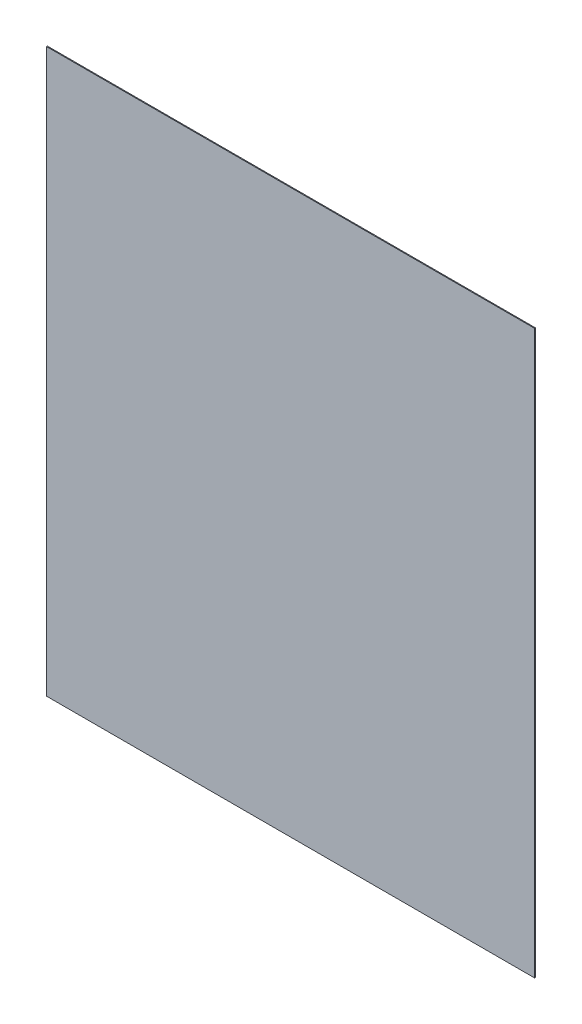
ISO-10303-21;
HEADER;
FILE_DESCRIPTION(('STEP AP214'),'2;1');
FILE_NAME('part.step','',(''),(''),'','','');
FILE_SCHEMA(('AUTOMOTIVE_DESIGN { 1 0 10303 214 1 1 1 1 }'));
ENDSEC;
DATA;
#1=APPLICATION_CONTEXT('core data for automotive mechanical design processes');
#2=APPLICATION_PROTOCOL_DEFINITION('international standard','automotive_design',2000,#1);
#3=PRODUCT_CONTEXT('',#1,'mechanical');
#4=PRODUCT('Part','Part','',(#3));
#5=PRODUCT_RELATED_PRODUCT_CATEGORY('part','',(#4));
#6=PRODUCT_DEFINITION_FORMATION('','',#4);
#7=PRODUCT_DEFINITION_CONTEXT('part definition',#1,'design');
#8=PRODUCT_DEFINITION('design','',#6,#7);
#9=PRODUCT_DEFINITION_SHAPE('','',#8);
#10=(LENGTH_UNIT() NAMED_UNIT(*) SI_UNIT(.MILLI.,.METRE.));
#11=(NAMED_UNIT(*) PLANE_ANGLE_UNIT() SI_UNIT($,.RADIAN.));
#12=(NAMED_UNIT(*) SI_UNIT($,.STERADIAN.) SOLID_ANGLE_UNIT());
#13=UNCERTAINTY_MEASURE_WITH_UNIT(LENGTH_MEASURE(1.E-05),#10,'distance_accuracy_value','');
#14=(GEOMETRIC_REPRESENTATION_CONTEXT(3) GLOBAL_UNCERTAINTY_ASSIGNED_CONTEXT((#13)) GLOBAL_UNIT_ASSIGNED_CONTEXT((#10,
#11,#12)) REPRESENTATION_CONTEXT('',''));
#15=CARTESIAN_POINT('',(0.,0.,0.));
#16=DIRECTION('',(0.,0.,1.));
#17=DIRECTION('',(1.,0.,0.));
#18=AXIS2_PLACEMENT_3D('',#15,#16,#17);
#19=CARTESIAN_POINT('',(250.,288.1,0.9));
#20=DIRECTION('',(-1.,0.,0.));
#21=DIRECTION('',(0.,-1.,0.));
#22=AXIS2_PLACEMENT_3D('',#19,#20,#21);
#23=PLANE('',#22);
#24=DIRECTION('',(0.,1.,0.));
#25=VECTOR('',#24,1.);
#26=CARTESIAN_POINT('',(250.,288.1,0.));
#27=LINE('',#26,#25);
#28=CARTESIAN_POINT('',(250.,-288.1,0.));
#29=VERTEX_POINT('',#28);
#30=CARTESIAN_POINT('',(250.,288.1,0.));
#31=VERTEX_POINT('',#30);
#32=EDGE_CURVE('E113',#29,#31,#27,.T.);
#33=ORIENTED_EDGE('',*,*,#32,.T.);
#34=DIRECTION('',(0.,0.,-1.));
#35=VECTOR('',#34,1.);
#36=CARTESIAN_POINT('',(250.,288.1,0.9));
#37=LINE('',#36,#35);
#38=CARTESIAN_POINT('',(250.,288.1,0.9));
#39=VERTEX_POINT('',#38);
#40=EDGE_CURVE('E11',#39,#31,#37,.T.);
#41=ORIENTED_EDGE('',*,*,#40,.F.);
#42=DIRECTION('',(0.,1.,0.));
#43=VECTOR('',#42,1.);
#44=CARTESIAN_POINT('',(250.,288.1,0.9));
#45=LINE('',#44,#43);
#46=CARTESIAN_POINT('',(250.,-288.1,0.9));
#47=VERTEX_POINT('',#46);
#48=EDGE_CURVE('E97',#47,#39,#45,.T.);
#49=ORIENTED_EDGE('',*,*,#48,.F.);
#50=DIRECTION('',(0.,0.,-1.));
#51=VECTOR('',#50,1.);
#52=CARTESIAN_POINT('',(250.,-288.1,0.9));
#53=LINE('',#52,#51);
#54=EDGE_CURVE('E109',#47,#29,#53,.T.);
#55=ORIENTED_EDGE('',*,*,#54,.T.);
#56=EDGE_LOOP('',(#33,#41,#49,#55));
#57=FACE_BOUND('',#56,.T.);
#58=ADVANCED_FACE('F45',(#57),#23,.F.);
#59=CARTESIAN_POINT('',(-250.,288.1,0.9));
#60=DIRECTION('',(0.,-1.,0.));
#61=DIRECTION('',(0.,0.,-1.));
#62=AXIS2_PLACEMENT_3D('',#59,#60,#61);
#63=PLANE('',#62);
#64=DIRECTION('',(-1.,0.,0.));
#65=VECTOR('',#64,1.);
#66=CARTESIAN_POINT('',(-250.,288.1,0.));
#67=LINE('',#66,#65);
#68=CARTESIAN_POINT('',(-250.,288.1,0.));
#69=VERTEX_POINT('',#68);
#70=EDGE_CURVE('E102',#31,#69,#67,.T.);
#71=ORIENTED_EDGE('',*,*,#70,.T.);
#72=DIRECTION('',(0.,0.,-1.));
#73=VECTOR('',#72,1.);
#74=CARTESIAN_POINT('',(-250.,288.1,0.9));
#75=LINE('',#74,#73);
#76=CARTESIAN_POINT('',(-250.,288.1,0.9));
#77=VERTEX_POINT('',#76);
#78=EDGE_CURVE('E54',#77,#69,#75,.T.);
#79=ORIENTED_EDGE('',*,*,#78,.F.);
#80=DIRECTION('',(-1.,0.,0.));
#81=VECTOR('',#80,1.);
#82=CARTESIAN_POINT('',(-250.,288.1,0.9));
#83=LINE('',#82,#81);
#84=EDGE_CURVE('E92',#39,#77,#83,.T.);
#85=ORIENTED_EDGE('',*,*,#84,.F.);
#86=ORIENTED_EDGE('',*,*,#40,.T.);
#87=EDGE_LOOP('',(#71,#79,#85,#86));
#88=FACE_BOUND('',#87,.T.);
#89=ADVANCED_FACE('F101',(#88),#63,.F.);
#90=CARTESIAN_POINT('',(-250.,288.1,0.9));
#91=DIRECTION('',(1.,0.,0.));
#92=DIRECTION('',(0.,1.,0.));
#93=AXIS2_PLACEMENT_3D('',#90,#91,#92);
#94=PLANE('',#93);
#95=DIRECTION('',(0.,-1.,0.));
#96=VECTOR('',#95,1.);
#97=CARTESIAN_POINT('',(-250.,288.1,0.));
#98=LINE('',#97,#96);
#99=CARTESIAN_POINT('',(-250.,-288.1,0.));
#100=VERTEX_POINT('',#99);
#101=EDGE_CURVE('E79',#69,#100,#98,.T.);
#102=ORIENTED_EDGE('',*,*,#101,.T.);
#103=DIRECTION('',(0.,0.,-1.));
#104=VECTOR('',#103,1.);
#105=CARTESIAN_POINT('',(-250.,-288.1,0.9));
#106=LINE('',#105,#104);
#107=CARTESIAN_POINT('',(-250.,-288.1,0.9));
#108=VERTEX_POINT('',#107);
#109=EDGE_CURVE('E104',#108,#100,#106,.T.);
#110=ORIENTED_EDGE('',*,*,#109,.F.);
#111=DIRECTION('',(0.,-1.,0.));
#112=VECTOR('',#111,1.);
#113=CARTESIAN_POINT('',(-250.,288.1,0.9));
#114=LINE('',#113,#112);
#115=EDGE_CURVE('E95',#77,#108,#114,.T.);
#116=ORIENTED_EDGE('',*,*,#115,.F.);
#117=ORIENTED_EDGE('',*,*,#78,.T.);
#118=EDGE_LOOP('',(#102,#110,#116,#117));
#119=FACE_BOUND('',#118,.T.);
#120=ADVANCED_FACE('F105',(#119),#94,.F.);
#121=CARTESIAN_POINT('',(-250.,-288.1,0.9));
#122=DIRECTION('',(0.,1.,0.));
#123=DIRECTION('',(0.,0.,1.));
#124=AXIS2_PLACEMENT_3D('',#121,#122,#123);
#125=PLANE('',#124);
#126=DIRECTION('',(1.,0.,0.));
#127=VECTOR('',#126,1.);
#128=CARTESIAN_POINT('',(-250.,-288.1,0.));
#129=LINE('',#128,#127);
#130=EDGE_CURVE('E85',#100,#29,#129,.T.);
#131=ORIENTED_EDGE('',*,*,#130,.T.);
#132=ORIENTED_EDGE('',*,*,#54,.F.);
#133=DIRECTION('',(1.,0.,0.));
#134=VECTOR('',#133,1.);
#135=CARTESIAN_POINT('',(-250.,-288.1,0.9));
#136=LINE('',#135,#134);
#137=EDGE_CURVE('E62',#108,#47,#136,.T.);
#138=ORIENTED_EDGE('',*,*,#137,.F.);
#139=ORIENTED_EDGE('',*,*,#109,.T.);
#140=EDGE_LOOP('',(#131,#132,#138,#139));
#141=FACE_BOUND('',#140,.T.);
#142=ADVANCED_FACE('F126',(#141),#125,.F.);
#143=CARTESIAN_POINT('',(0.,0.,0.9));
#144=DIRECTION('',(0.,0.,1.));
#145=DIRECTION('',(1.,0.,0.));
#146=AXIS2_PLACEMENT_3D('',#143,#144,#145);
#147=PLANE('',#146);
#148=ORIENTED_EDGE('',*,*,#48,.T.);
#149=ORIENTED_EDGE('',*,*,#84,.T.);
#150=ORIENTED_EDGE('',*,*,#115,.T.);
#151=ORIENTED_EDGE('',*,*,#137,.T.);
#152=EDGE_LOOP('',(#148,#149,#150,#151));
#153=FACE_BOUND('',#152,.T.);
#154=ADVANCED_FACE('F93',(#153),#147,.T.);
#155=CARTESIAN_POINT('',(0.,0.,0.));
#156=DIRECTION('',(0.,0.,1.));
#157=DIRECTION('',(1.,0.,0.));
#158=AXIS2_PLACEMENT_3D('',#155,#156,#157);
#159=PLANE('',#158);
#160=ORIENTED_EDGE('',*,*,#32,.F.);
#161=ORIENTED_EDGE('',*,*,#130,.F.);
#162=ORIENTED_EDGE('',*,*,#101,.F.);
#163=ORIENTED_EDGE('',*,*,#70,.F.);
#164=EDGE_LOOP('',(#160,#161,#162,#163));
#165=FACE_BOUND('',#164,.T.);
#166=ADVANCED_FACE('F129',(#165),#159,.F.);
#167=CLOSED_SHELL('',(#58,#89,#120,#142,#154,#166));
#168=MANIFOLD_SOLID_BREP('B2',#167);
#169=ADVANCED_BREP_SHAPE_REPRESENTATION('',(#18,#168),#14);
#170=SHAPE_DEFINITION_REPRESENTATION(#9,#169);
ENDSEC;
END-ISO-10303-21;
